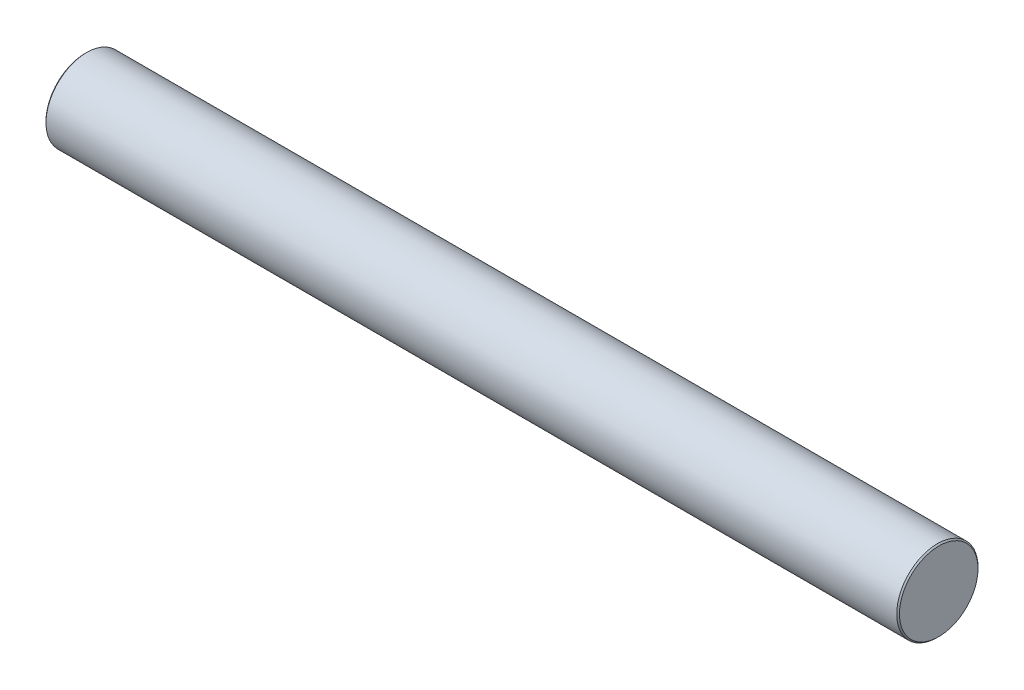
ISO-10303-21;
HEADER;
FILE_DESCRIPTION(('STEP AP214'),'2;1');
FILE_NAME('part.step','',(''),(''),'','','');
FILE_SCHEMA(('AUTOMOTIVE_DESIGN { 1 0 10303 214 1 1 1 1 }'));
ENDSEC;
DATA;
#1=APPLICATION_CONTEXT('core data for automotive mechanical design processes');
#2=APPLICATION_PROTOCOL_DEFINITION('international standard','automotive_design',2000,#1);
#3=PRODUCT_CONTEXT('',#1,'mechanical');
#4=PRODUCT('Part','Part','',(#3));
#5=PRODUCT_RELATED_PRODUCT_CATEGORY('part','',(#4));
#6=PRODUCT_DEFINITION_FORMATION('','',#4);
#7=PRODUCT_DEFINITION_CONTEXT('part definition',#1,'design');
#8=PRODUCT_DEFINITION('design','',#6,#7);
#9=PRODUCT_DEFINITION_SHAPE('','',#8);
#10=(LENGTH_UNIT() NAMED_UNIT(*) SI_UNIT(.MILLI.,.METRE.));
#11=(NAMED_UNIT(*) PLANE_ANGLE_UNIT() SI_UNIT($,.RADIAN.));
#12=(NAMED_UNIT(*) SI_UNIT($,.STERADIAN.) SOLID_ANGLE_UNIT());
#13=UNCERTAINTY_MEASURE_WITH_UNIT(LENGTH_MEASURE(1.E-05),#10,'distance_accuracy_value','');
#14=(GEOMETRIC_REPRESENTATION_CONTEXT(3) GLOBAL_UNCERTAINTY_ASSIGNED_CONTEXT((#13)) GLOBAL_UNIT_ASSIGNED_CONTEXT((#10,
#11,#12)) REPRESENTATION_CONTEXT('',''));
#15=CARTESIAN_POINT('',(0.,0.,0.));
#16=DIRECTION('',(0.,0.,1.));
#17=DIRECTION('',(1.,0.,0.));
#18=AXIS2_PLACEMENT_3D('',#15,#16,#17);
#19=CARTESIAN_POINT('',(31.5,0.,0.));
#20=DIRECTION('',(1.,0.,0.));
#21=DIRECTION('',(0.,1.,0.));
#22=AXIS2_PLACEMENT_3D('',#19,#20,#21);
#23=PLANE('',#22);
#24=CARTESIAN_POINT('',(31.5,0.,0.));
#25=DIRECTION('',(1.,0.,0.));
#26=DIRECTION('',(0.,1.,0.));
#27=AXIS2_PLACEMENT_3D('',#24,#25,#26);
#28=CIRCLE('',#27,2.89999999999997);
#29=CARTESIAN_POINT('',(31.5,2.89999999999998,0.));
#30=VERTEX_POINT('',#29);
#31=EDGE_CURVE('E10',#30,#30,#28,.T.);
#32=ORIENTED_EDGE('',*,*,#31,.T.);
#33=EDGE_LOOP('',(#32));
#34=FACE_BOUND('',#33,.T.);
#35=ADVANCED_FACE('F34',(#34),#23,.T.);
#36=CARTESIAN_POINT('',(-18.8523510455525,0.,0.));
#37=DIRECTION('',(1.,0.,0.));
#38=DIRECTION('',(0.,1.,0.));
#39=AXIS2_PLACEMENT_3D('',#36,#37,#38);
#40=CYLINDRICAL_SURFACE('',#39,2.99999999999999);
#41=CARTESIAN_POINT('',(-31.4,0.,0.));
#42=DIRECTION('',(1.,0.,0.));
#43=DIRECTION('',(0.,1.,0.));
#44=AXIS2_PLACEMENT_3D('',#41,#42,#43);
#45=CIRCLE('',#44,2.99999999999999);
#46=CARTESIAN_POINT('',(-31.4,2.99999999999999,0.));
#47=VERTEX_POINT('',#46);
#48=EDGE_CURVE('E46',#47,#47,#45,.T.);
#49=ORIENTED_EDGE('',*,*,#48,.T.);
#50=EDGE_LOOP('',(#49));
#51=FACE_BOUND('',#50,.T.);
#52=CARTESIAN_POINT('',(31.4,0.,0.));
#53=DIRECTION('',(1.,0.,0.));
#54=DIRECTION('',(0.,1.,0.));
#55=AXIS2_PLACEMENT_3D('',#52,#53,#54);
#56=CIRCLE('',#55,2.99999999999999);
#57=CARTESIAN_POINT('',(31.4,2.99999999999999,0.));
#58=VERTEX_POINT('',#57);
#59=EDGE_CURVE('E50',#58,#58,#56,.F.);
#60=ORIENTED_EDGE('',*,*,#59,.T.);
#61=EDGE_LOOP('',(#60));
#62=FACE_BOUND('',#61,.T.);
#63=ADVANCED_FACE('F56',(#51,#62),#40,.T.);
#64=CARTESIAN_POINT('',(-31.5,0.,0.));
#65=DIRECTION('',(1.,0.,0.));
#66=DIRECTION('',(0.,1.,0.));
#67=AXIS2_PLACEMENT_3D('',#64,#65,#66);
#68=PLANE('',#67);
#69=CARTESIAN_POINT('',(-31.5,0.,0.));
#70=DIRECTION('',(1.,0.,0.));
#71=DIRECTION('',(0.,1.,0.));
#72=AXIS2_PLACEMENT_3D('',#69,#70,#71);
#73=CIRCLE('',#72,2.89999999999998);
#74=CARTESIAN_POINT('',(-31.5,2.89999999999998,0.));
#75=VERTEX_POINT('',#74);
#76=EDGE_CURVE('E42',#75,#75,#73,.F.);
#77=ORIENTED_EDGE('',*,*,#76,.T.);
#78=EDGE_LOOP('',(#77));
#79=FACE_BOUND('',#78,.T.);
#80=ADVANCED_FACE('F64',(#79),#68,.F.);
#81=CARTESIAN_POINT('',(-31.4,0.,0.));
#82=DIRECTION('',(1.,0.,0.));
#83=DIRECTION('',(0.,1.,0.));
#84=AXIS2_PLACEMENT_3D('',#81,#82,#83);
#85=CONICAL_SURFACE('',#84,2.99999999999999,0.785398163397433);
#86=ORIENTED_EDGE('',*,*,#76,.F.);
#87=EDGE_LOOP('',(#86));
#88=FACE_BOUND('',#87,.T.);
#89=ORIENTED_EDGE('',*,*,#48,.F.);
#90=EDGE_LOOP('',(#89));
#91=FACE_BOUND('',#90,.T.);
#92=ADVANCED_FACE('F60',(#88,#91),#85,.T.);
#93=CARTESIAN_POINT('',(31.5,0.,0.));
#94=DIRECTION('',(-1.,0.,0.));
#95=DIRECTION('',(0.,-1.,0.));
#96=AXIS2_PLACEMENT_3D('',#93,#94,#95);
#97=CONICAL_SURFACE('',#96,2.89999999999997,0.785398163397468);
#98=ORIENTED_EDGE('',*,*,#59,.F.);
#99=EDGE_LOOP('',(#98));
#100=FACE_BOUND('',#99,.T.);
#101=ORIENTED_EDGE('',*,*,#31,.F.);
#102=EDGE_LOOP('',(#101));
#103=FACE_BOUND('',#102,.T.);
#104=ADVANCED_FACE('F37',(#100,#103),#97,.T.);
#105=CLOSED_SHELL('',(#35,#63,#80,#92,#104));
#106=MANIFOLD_SOLID_BREP('B2',#105);
#107=ADVANCED_BREP_SHAPE_REPRESENTATION('',(#18,#106),#14);
#108=SHAPE_DEFINITION_REPRESENTATION(#9,#107);
ENDSEC;
END-ISO-10303-21;
